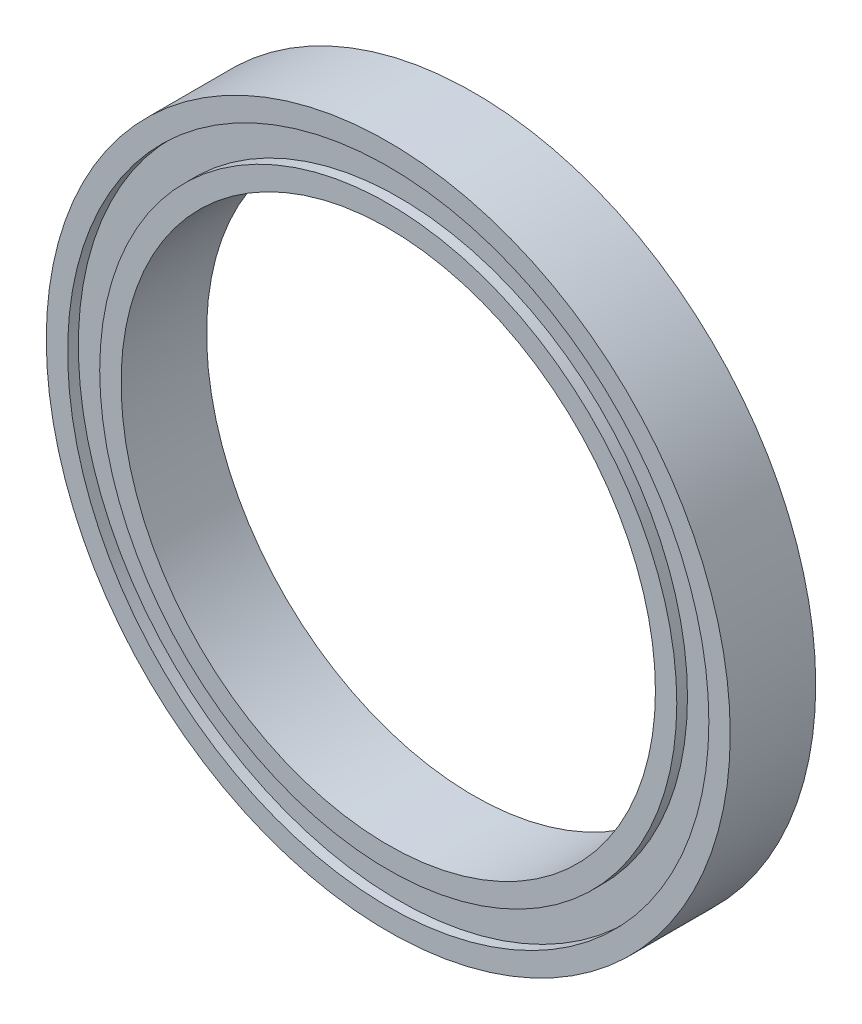
ISO-10303-21;
HEADER;
FILE_DESCRIPTION(('STEP AP214'),'2;1');
FILE_NAME('part.step','',(''),(''),'','','');
FILE_SCHEMA(('AUTOMOTIVE_DESIGN { 1 0 10303 214 1 1 1 1 }'));
ENDSEC;
DATA;
#1=APPLICATION_CONTEXT('core data for automotive mechanical design processes');
#2=APPLICATION_PROTOCOL_DEFINITION('international standard','automotive_design',2000,#1);
#3=PRODUCT_CONTEXT('',#1,'mechanical');
#4=PRODUCT('Part','Part','',(#3));
#5=PRODUCT_RELATED_PRODUCT_CATEGORY('part','',(#4));
#6=PRODUCT_DEFINITION_FORMATION('','',#4);
#7=PRODUCT_DEFINITION_CONTEXT('part definition',#1,'design');
#8=PRODUCT_DEFINITION('design','',#6,#7);
#9=PRODUCT_DEFINITION_SHAPE('','',#8);
#10=(LENGTH_UNIT() NAMED_UNIT(*) SI_UNIT(.MILLI.,.METRE.));
#11=(NAMED_UNIT(*) PLANE_ANGLE_UNIT() SI_UNIT($,.RADIAN.));
#12=(NAMED_UNIT(*) SI_UNIT($,.STERADIAN.) SOLID_ANGLE_UNIT());
#13=UNCERTAINTY_MEASURE_WITH_UNIT(LENGTH_MEASURE(1.E-05),#10,'distance_accuracy_value','');
#14=(GEOMETRIC_REPRESENTATION_CONTEXT(3) GLOBAL_UNCERTAINTY_ASSIGNED_CONTEXT((#13)) GLOBAL_UNIT_ASSIGNED_CONTEXT((#10,
#11,#12)) REPRESENTATION_CONTEXT('',''));
#15=CARTESIAN_POINT('',(0.,0.,0.));
#16=DIRECTION('',(0.,0.,1.));
#17=DIRECTION('',(1.,0.,0.));
#18=AXIS2_PLACEMENT_3D('',#15,#16,#17);
#19=CARTESIAN_POINT('',(0.,0.,-4.));
#20=DIRECTION('',(0.,0.,1.));
#21=DIRECTION('',(-1.,0.,0.));
#22=AXIS2_PLACEMENT_3D('',#19,#20,#21);
#23=CYLINDRICAL_SURFACE('',#22,13.5);
#24=CARTESIAN_POINT('',(0.,0.,0.));
#25=DIRECTION('',(0.,0.,1.));
#26=DIRECTION('',(1.,0.,0.));
#27=AXIS2_PLACEMENT_3D('',#24,#25,#26);
#28=CIRCLE('',#27,13.5);
#29=CARTESIAN_POINT('',(13.5,0.,0.));
#30=VERTEX_POINT('',#29);
#31=EDGE_CURVE('E51',#30,#30,#28,.T.);
#32=ORIENTED_EDGE('',*,*,#31,.F.);
#33=EDGE_LOOP('',(#32));
#34=FACE_BOUND('',#33,.T.);
#35=CARTESIAN_POINT('',(0.,0.,-0.5));
#36=DIRECTION('',(0.,0.,1.));
#37=DIRECTION('',(1.,0.,0.));
#38=AXIS2_PLACEMENT_3D('',#35,#36,#37);
#39=CIRCLE('',#38,13.5);
#40=CARTESIAN_POINT('',(13.5,0.,-0.5));
#41=VERTEX_POINT('',#40);
#42=EDGE_CURVE('E10',#41,#41,#39,.T.);
#43=ORIENTED_EDGE('',*,*,#42,.T.);
#44=EDGE_LOOP('',(#43));
#45=FACE_BOUND('',#44,.T.);
#46=ADVANCED_FACE('F35',(#34,#45),#23,.T.);
#47=CARTESIAN_POINT('',(0.,0.,-4.));
#48=DIRECTION('',(0.,0.,1.));
#49=DIRECTION('',(-1.,0.,0.));
#50=AXIS2_PLACEMENT_3D('',#47,#48,#49);
#51=CYLINDRICAL_SURFACE('',#50,12.5);
#52=CARTESIAN_POINT('',(0.,0.,-4.));
#53=DIRECTION('',(0.,0.,1.));
#54=DIRECTION('',(1.,0.,0.));
#55=AXIS2_PLACEMENT_3D('',#52,#53,#54);
#56=CIRCLE('',#55,12.5);
#57=CARTESIAN_POINT('',(12.5,0.,-4.));
#58=VERTEX_POINT('',#57);
#59=EDGE_CURVE('E46',#58,#58,#56,.T.);
#60=ORIENTED_EDGE('',*,*,#59,.F.);
#61=EDGE_LOOP('',(#60));
#62=FACE_BOUND('',#61,.T.);
#63=CARTESIAN_POINT('',(0.,0.,0.));
#64=DIRECTION('',(0.,0.,1.));
#65=DIRECTION('',(1.,0.,0.));
#66=AXIS2_PLACEMENT_3D('',#63,#64,#65);
#67=CIRCLE('',#66,12.5);
#68=CARTESIAN_POINT('',(12.5,0.,0.));
#69=VERTEX_POINT('',#68);
#70=EDGE_CURVE('E55',#69,#69,#67,.T.);
#71=ORIENTED_EDGE('',*,*,#70,.T.);
#72=EDGE_LOOP('',(#71));
#73=FACE_BOUND('',#72,.T.);
#74=ADVANCED_FACE('F37',(#62,#73),#51,.F.);
#75=CARTESIAN_POINT('',(0.,0.,-3.5));
#76=DIRECTION('',(0.,0.,1.));
#77=DIRECTION('',(1.,0.,0.));
#78=AXIS2_PLACEMENT_3D('',#75,#76,#77);
#79=CIRCLE('',#78,13.5);
#80=CARTESIAN_POINT('',(13.5,0.,-3.5));
#81=VERTEX_POINT('',#80);
#82=EDGE_CURVE('E80',#81,#81,#79,.T.);
#83=ORIENTED_EDGE('',*,*,#82,.F.);
#84=EDGE_LOOP('',(#83));
#85=FACE_BOUND('',#84,.T.);
#86=CARTESIAN_POINT('',(0.,0.,-4.));
#87=DIRECTION('',(0.,0.,1.));
#88=DIRECTION('',(1.,0.,0.));
#89=AXIS2_PLACEMENT_3D('',#86,#87,#88);
#90=CIRCLE('',#89,13.5);
#91=CARTESIAN_POINT('',(13.5,0.,-4.));
#92=VERTEX_POINT('',#91);
#93=EDGE_CURVE('E42',#92,#92,#90,.T.);
#94=ORIENTED_EDGE('',*,*,#93,.T.);
#95=EDGE_LOOP('',(#94));
#96=FACE_BOUND('',#95,.T.);
#97=ADVANCED_FACE('F64',(#85,#96),#23,.T.);
#98=CARTESIAN_POINT('',(0.,0.,-4.));
#99=DIRECTION('',(0.,0.,-1.));
#100=DIRECTION('',(1.,0.,0.));
#101=AXIS2_PLACEMENT_3D('',#98,#99,#100);
#102=PLANE('',#101);
#103=ORIENTED_EDGE('',*,*,#59,.T.);
#104=EDGE_LOOP('',(#103));
#105=FACE_BOUND('',#104,.T.);
#106=ORIENTED_EDGE('',*,*,#93,.F.);
#107=EDGE_LOOP('',(#106));
#108=FACE_BOUND('',#107,.T.);
#109=ADVANCED_FACE('F71',(#105,#108),#102,.T.);
#110=CARTESIAN_POINT('',(0.,0.,0.));
#111=DIRECTION('',(0.,0.,-1.));
#112=DIRECTION('',(1.,0.,0.));
#113=AXIS2_PLACEMENT_3D('',#110,#111,#112);
#114=PLANE('',#113);
#115=ORIENTED_EDGE('',*,*,#70,.F.);
#116=EDGE_LOOP('',(#115));
#117=FACE_BOUND('',#116,.T.);
#118=ORIENTED_EDGE('',*,*,#31,.T.);
#119=EDGE_LOOP('',(#118));
#120=FACE_BOUND('',#119,.T.);
#121=ADVANCED_FACE('F61',(#117,#120),#114,.F.);
#122=CARTESIAN_POINT('',(0.,0.,-0.5));
#123=DIRECTION('',(0.,0.,-1.));
#124=DIRECTION('',(1.,0.,0.));
#125=AXIS2_PLACEMENT_3D('',#122,#123,#124);
#126=PLANE('',#125);
#127=ORIENTED_EDGE('',*,*,#42,.F.);
#128=EDGE_LOOP('',(#127));
#129=FACE_BOUND('',#128,.T.);
#130=CARTESIAN_POINT('',(0.,0.,-0.5));
#131=DIRECTION('',(0.,0.,1.));
#132=DIRECTION('',(1.,0.,0.));
#133=AXIS2_PLACEMENT_3D('',#130,#131,#132);
#134=CIRCLE('',#133,15.);
#135=CARTESIAN_POINT('',(15.,0.,-0.5));
#136=VERTEX_POINT('',#135);
#137=EDGE_CURVE('E57',#136,#136,#134,.T.);
#138=ORIENTED_EDGE('',*,*,#137,.T.);
#139=EDGE_LOOP('',(#138));
#140=FACE_BOUND('',#139,.T.);
#141=ADVANCED_FACE('F121',(#129,#140),#126,.F.);
#142=CARTESIAN_POINT('',(0.,0.,-3.5));
#143=DIRECTION('',(0.,0.,-1.));
#144=DIRECTION('',(1.,0.,0.));
#145=AXIS2_PLACEMENT_3D('',#142,#143,#144);
#146=PLANE('',#145);
#147=ORIENTED_EDGE('',*,*,#82,.T.);
#148=EDGE_LOOP('',(#147));
#149=FACE_BOUND('',#148,.T.);
#150=CARTESIAN_POINT('',(0.,0.,-3.5));
#151=DIRECTION('',(0.,0.,1.));
#152=DIRECTION('',(1.,0.,0.));
#153=AXIS2_PLACEMENT_3D('',#150,#151,#152);
#154=CIRCLE('',#153,15.);
#155=CARTESIAN_POINT('',(15.,0.,-3.5));
#156=VERTEX_POINT('',#155);
#157=EDGE_CURVE('E82',#156,#156,#154,.F.);
#158=ORIENTED_EDGE('',*,*,#157,.T.);
#159=EDGE_LOOP('',(#158));
#160=FACE_BOUND('',#159,.T.);
#161=ADVANCED_FACE('F116',(#149,#160),#146,.T.);
#162=CARTESIAN_POINT('',(0.,0.,-4.));
#163=DIRECTION('',(0.,0.,1.));
#164=DIRECTION('',(-1.,0.,0.));
#165=AXIS2_PLACEMENT_3D('',#162,#163,#164);
#166=CYLINDRICAL_SURFACE('',#165,15.);
#167=CARTESIAN_POINT('',(0.,0.,0.));
#168=DIRECTION('',(0.,0.,1.));
#169=DIRECTION('',(1.,0.,0.));
#170=AXIS2_PLACEMENT_3D('',#167,#168,#169);
#171=CIRCLE('',#170,15.);
#172=CARTESIAN_POINT('',(15.,0.,0.));
#173=VERTEX_POINT('',#172);
#174=EDGE_CURVE('E93',#173,#173,#171,.T.);
#175=ORIENTED_EDGE('',*,*,#174,.T.);
#176=EDGE_LOOP('',(#175));
#177=FACE_BOUND('',#176,.T.);
#178=ORIENTED_EDGE('',*,*,#137,.F.);
#179=EDGE_LOOP('',(#178));
#180=FACE_BOUND('',#179,.T.);
#181=ADVANCED_FACE('F107',(#177,#180),#166,.F.);
#182=ORIENTED_EDGE('',*,*,#157,.F.);
#183=EDGE_LOOP('',(#182));
#184=FACE_BOUND('',#183,.T.);
#185=CARTESIAN_POINT('',(0.,0.,-4.));
#186=DIRECTION('',(0.,0.,1.));
#187=DIRECTION('',(1.,0.,0.));
#188=AXIS2_PLACEMENT_3D('',#185,#186,#187);
#189=CIRCLE('',#188,15.);
#190=CARTESIAN_POINT('',(15.,0.,-4.));
#191=VERTEX_POINT('',#190);
#192=EDGE_CURVE('E92',#191,#191,#189,.T.);
#193=ORIENTED_EDGE('',*,*,#192,.F.);
#194=EDGE_LOOP('',(#193));
#195=FACE_BOUND('',#194,.T.);
#196=ADVANCED_FACE('F104',(#184,#195),#166,.F.);
#197=CARTESIAN_POINT('',(0.,0.,-4.));
#198=DIRECTION('',(0.,0.,1.));
#199=DIRECTION('',(-1.,0.,0.));
#200=AXIS2_PLACEMENT_3D('',#197,#198,#199);
#201=CYLINDRICAL_SURFACE('',#200,16.);
#202=CARTESIAN_POINT('',(0.,0.,-4.));
#203=DIRECTION('',(0.,0.,1.));
#204=DIRECTION('',(1.,0.,0.));
#205=AXIS2_PLACEMENT_3D('',#202,#203,#204);
#206=CIRCLE('',#205,16.);
#207=CARTESIAN_POINT('',(16.,0.,-4.));
#208=VERTEX_POINT('',#207);
#209=EDGE_CURVE('E86',#208,#208,#206,.T.);
#210=ORIENTED_EDGE('',*,*,#209,.T.);
#211=EDGE_LOOP('',(#210));
#212=FACE_BOUND('',#211,.T.);
#213=CARTESIAN_POINT('',(0.,0.,0.));
#214=DIRECTION('',(0.,0.,1.));
#215=DIRECTION('',(1.,0.,0.));
#216=AXIS2_PLACEMENT_3D('',#213,#214,#215);
#217=CIRCLE('',#216,16.);
#218=CARTESIAN_POINT('',(16.,0.,0.));
#219=VERTEX_POINT('',#218);
#220=EDGE_CURVE('E89',#219,#219,#217,.T.);
#221=ORIENTED_EDGE('',*,*,#220,.F.);
#222=EDGE_LOOP('',(#221));
#223=FACE_BOUND('',#222,.T.);
#224=ADVANCED_FACE('F106',(#212,#223),#201,.T.);
#225=CARTESIAN_POINT('',(0.,0.,-4.));
#226=DIRECTION('',(0.,0.,-1.));
#227=DIRECTION('',(1.,0.,0.));
#228=AXIS2_PLACEMENT_3D('',#225,#226,#227);
#229=PLANE('',#228);
#230=ORIENTED_EDGE('',*,*,#192,.T.);
#231=EDGE_LOOP('',(#230));
#232=FACE_BOUND('',#231,.T.);
#233=ORIENTED_EDGE('',*,*,#209,.F.);
#234=EDGE_LOOP('',(#233));
#235=FACE_BOUND('',#234,.T.);
#236=ADVANCED_FACE('F101',(#232,#235),#229,.T.);
#237=CARTESIAN_POINT('',(0.,0.,0.));
#238=DIRECTION('',(0.,0.,-1.));
#239=DIRECTION('',(1.,0.,0.));
#240=AXIS2_PLACEMENT_3D('',#237,#238,#239);
#241=PLANE('',#240);
#242=ORIENTED_EDGE('',*,*,#174,.F.);
#243=EDGE_LOOP('',(#242));
#244=FACE_BOUND('',#243,.T.);
#245=ORIENTED_EDGE('',*,*,#220,.T.);
#246=EDGE_LOOP('',(#245));
#247=FACE_BOUND('',#246,.T.);
#248=ADVANCED_FACE('F165',(#244,#247),#241,.F.);
#249=CLOSED_SHELL('',(#46,#74,#97,#109,#121,#141,#161,#181,#196,#224,#236,#248));
#250=MANIFOLD_SOLID_BREP('B2',#249);
#251=ADVANCED_BREP_SHAPE_REPRESENTATION('',(#18,#250),#14);
#252=SHAPE_DEFINITION_REPRESENTATION(#9,#251);
ENDSEC;
END-ISO-10303-21;
